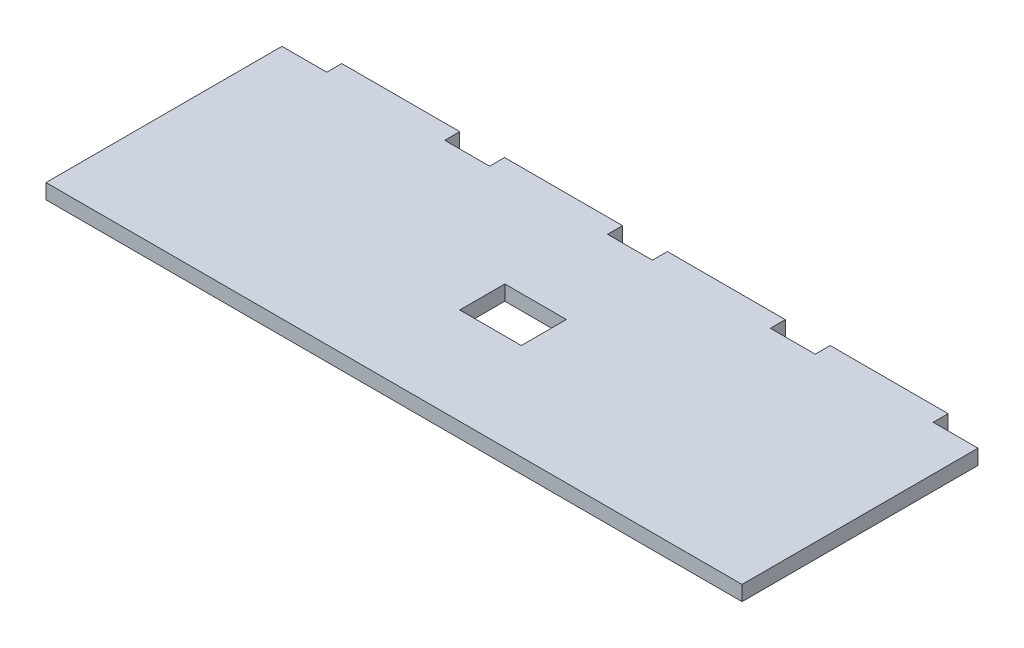
ISO-10303-21;
HEADER;
FILE_DESCRIPTION(('STEP AP214'),'2;1');
FILE_NAME('part.step','',(''),(''),'','','');
FILE_SCHEMA(('AUTOMOTIVE_DESIGN { 1 0 10303 214 1 1 1 1 }'));
ENDSEC;
DATA;
#1=APPLICATION_CONTEXT('core data for automotive mechanical design processes');
#2=APPLICATION_PROTOCOL_DEFINITION('international standard','automotive_design',2000,#1);
#3=PRODUCT_CONTEXT('',#1,'mechanical');
#4=PRODUCT('Part','Part','',(#3));
#5=PRODUCT_RELATED_PRODUCT_CATEGORY('part','',(#4));
#6=PRODUCT_DEFINITION_FORMATION('','',#4);
#7=PRODUCT_DEFINITION_CONTEXT('part definition',#1,'design');
#8=PRODUCT_DEFINITION('design','',#6,#7);
#9=PRODUCT_DEFINITION_SHAPE('','',#8);
#10=(LENGTH_UNIT() NAMED_UNIT(*) SI_UNIT(.MILLI.,.METRE.));
#11=(NAMED_UNIT(*) PLANE_ANGLE_UNIT() SI_UNIT($,.RADIAN.));
#12=(NAMED_UNIT(*) SI_UNIT($,.STERADIAN.) SOLID_ANGLE_UNIT());
#13=UNCERTAINTY_MEASURE_WITH_UNIT(LENGTH_MEASURE(1.E-05),#10,'distance_accuracy_value','');
#14=(GEOMETRIC_REPRESENTATION_CONTEXT(3) GLOBAL_UNCERTAINTY_ASSIGNED_CONTEXT((#13)) GLOBAL_UNIT_ASSIGNED_CONTEXT((#10,
#11,#12)) REPRESENTATION_CONTEXT('',''));
#15=CARTESIAN_POINT('',(0.,0.,0.));
#16=DIRECTION('',(0.,0.,1.));
#17=DIRECTION('',(1.,0.,0.));
#18=AXIS2_PLACEMENT_3D('',#15,#16,#17);
#19=CARTESIAN_POINT('',(0.,6.35,0.));
#20=DIRECTION('',(0.,1.,0.));
#21=DIRECTION('',(0.,0.,1.));
#22=AXIS2_PLACEMENT_3D('',#19,#20,#21);
#23=PLANE('',#22);
#24=DIRECTION('',(-1.,0.,0.));
#25=VECTOR('',#24,1.);
#26=CARTESIAN_POINT('',(0.,6.35,0.));
#27=LINE('',#26,#25);
#28=CARTESIAN_POINT('',(19.,6.35,0.));
#29=VERTEX_POINT('',#28);
#30=CARTESIAN_POINT('',(0.,6.35,0.));
#31=VERTEX_POINT('',#30);
#32=EDGE_CURVE('E230',#29,#31,#27,.T.);
#33=ORIENTED_EDGE('',*,*,#32,.T.);
#34=DIRECTION('',(0.,0.,1.));
#35=VECTOR('',#34,1.);
#36=CARTESIAN_POINT('',(0.,6.35,0.));
#37=LINE('',#36,#35);
#38=CARTESIAN_POINT('',(0.,6.35,100.));
#39=VERTEX_POINT('',#38);
#40=EDGE_CURVE('E233',#31,#39,#37,.T.);
#41=ORIENTED_EDGE('',*,*,#40,.T.);
#42=DIRECTION('',(1.,0.,0.));
#43=VECTOR('',#42,1.);
#44=CARTESIAN_POINT('',(0.,6.35,100.));
#45=LINE('',#44,#43);
#46=CARTESIAN_POINT('',(295.,6.35,100.));
#47=VERTEX_POINT('',#46);
#48=EDGE_CURVE('E236',#39,#47,#45,.T.);
#49=ORIENTED_EDGE('',*,*,#48,.T.);
#50=DIRECTION('',(0.,0.,-1.));
#51=VECTOR('',#50,1.);
#52=CARTESIAN_POINT('',(295.,6.35,0.));
#53=LINE('',#52,#51);
#54=CARTESIAN_POINT('',(295.,6.35,0.));
#55=VERTEX_POINT('',#54);
#56=EDGE_CURVE('E238',#47,#55,#53,.T.);
#57=ORIENTED_EDGE('',*,*,#56,.T.);
#58=DIRECTION('',(-1.,0.,0.));
#59=VECTOR('',#58,1.);
#60=CARTESIAN_POINT('',(276.,6.35,0.));
#61=LINE('',#60,#59);
#62=CARTESIAN_POINT('',(276.,6.35,0.));
#63=VERTEX_POINT('',#62);
#64=EDGE_CURVE('E240',#55,#63,#61,.T.);
#65=ORIENTED_EDGE('',*,*,#64,.T.);
#66=DIRECTION('',(0.,0.,-1.));
#67=VECTOR('',#66,1.);
#68=CARTESIAN_POINT('',(276.,6.35,0.));
#69=LINE('',#68,#67);
#70=CARTESIAN_POINT('',(276.,6.35,-6.35));
#71=VERTEX_POINT('',#70);
#72=EDGE_CURVE('E242',#63,#71,#69,.T.);
#73=ORIENTED_EDGE('',*,*,#72,.T.);
#74=DIRECTION('',(-1.,0.,0.));
#75=VECTOR('',#74,1.);
#76=CARTESIAN_POINT('',(226.,6.35,-6.35));
#77=LINE('',#76,#75);
#78=CARTESIAN_POINT('',(226.,6.35,-6.35));
#79=VERTEX_POINT('',#78);
#80=EDGE_CURVE('E244',#71,#79,#77,.T.);
#81=ORIENTED_EDGE('',*,*,#80,.T.);
#82=DIRECTION('',(0.,0.,1.));
#83=VECTOR('',#82,1.);
#84=CARTESIAN_POINT('',(226.,6.35,0.));
#85=LINE('',#84,#83);
#86=CARTESIAN_POINT('',(226.,6.35,0.));
#87=VERTEX_POINT('',#86);
#88=EDGE_CURVE('E246',#79,#87,#85,.T.);
#89=ORIENTED_EDGE('',*,*,#88,.T.);
#90=DIRECTION('',(-1.,0.,0.));
#91=VECTOR('',#90,1.);
#92=CARTESIAN_POINT('',(207.,6.35,0.));
#93=LINE('',#92,#91);
#94=CARTESIAN_POINT('',(207.,6.35,0.));
#95=VERTEX_POINT('',#94);
#96=EDGE_CURVE('E248',#87,#95,#93,.T.);
#97=ORIENTED_EDGE('',*,*,#96,.T.);
#98=DIRECTION('',(0.,0.,-1.));
#99=VECTOR('',#98,1.);
#100=CARTESIAN_POINT('',(207.,6.35,0.));
#101=LINE('',#100,#99);
#102=CARTESIAN_POINT('',(207.,6.35,-6.35));
#103=VERTEX_POINT('',#102);
#104=EDGE_CURVE('E250',#95,#103,#101,.T.);
#105=ORIENTED_EDGE('',*,*,#104,.T.);
#106=DIRECTION('',(-1.,0.,0.));
#107=VECTOR('',#106,1.);
#108=CARTESIAN_POINT('',(157.,6.35,-6.35));
#109=LINE('',#108,#107);
#110=CARTESIAN_POINT('',(157.,6.35,-6.35));
#111=VERTEX_POINT('',#110);
#112=EDGE_CURVE('E252',#103,#111,#109,.T.);
#113=ORIENTED_EDGE('',*,*,#112,.T.);
#114=DIRECTION('',(0.,0.,1.));
#115=VECTOR('',#114,1.);
#116=CARTESIAN_POINT('',(157.,6.35,0.));
#117=LINE('',#116,#115);
#118=CARTESIAN_POINT('',(157.,6.35,0.));
#119=VERTEX_POINT('',#118);
#120=EDGE_CURVE('E254',#111,#119,#117,.T.);
#121=ORIENTED_EDGE('',*,*,#120,.T.);
#122=DIRECTION('',(-1.,0.,0.));
#123=VECTOR('',#122,1.);
#124=CARTESIAN_POINT('',(138.,6.35,0.));
#125=LINE('',#124,#123);
#126=CARTESIAN_POINT('',(138.,6.35,0.));
#127=VERTEX_POINT('',#126);
#128=EDGE_CURVE('E256',#119,#127,#125,.T.);
#129=ORIENTED_EDGE('',*,*,#128,.T.);
#130=DIRECTION('',(0.,0.,-1.));
#131=VECTOR('',#130,1.);
#132=CARTESIAN_POINT('',(138.,6.35,0.));
#133=LINE('',#132,#131);
#134=CARTESIAN_POINT('',(138.,6.35,-6.35));
#135=VERTEX_POINT('',#134);
#136=EDGE_CURVE('E258',#127,#135,#133,.T.);
#137=ORIENTED_EDGE('',*,*,#136,.T.);
#138=DIRECTION('',(-1.,0.,0.));
#139=VECTOR('',#138,1.);
#140=CARTESIAN_POINT('',(88.,6.35,-6.35));
#141=LINE('',#140,#139);
#142=CARTESIAN_POINT('',(88.,6.35,-6.35));
#143=VERTEX_POINT('',#142);
#144=EDGE_CURVE('E260',#135,#143,#141,.T.);
#145=ORIENTED_EDGE('',*,*,#144,.T.);
#146=DIRECTION('',(0.,0.,1.));
#147=VECTOR('',#146,1.);
#148=CARTESIAN_POINT('',(88.,6.35,0.));
#149=LINE('',#148,#147);
#150=CARTESIAN_POINT('',(88.,6.35,0.));
#151=VERTEX_POINT('',#150);
#152=EDGE_CURVE('E262',#143,#151,#149,.T.);
#153=ORIENTED_EDGE('',*,*,#152,.T.);
#154=DIRECTION('',(-1.,0.,0.));
#155=VECTOR('',#154,1.);
#156=CARTESIAN_POINT('',(69.,6.35,0.));
#157=LINE('',#156,#155);
#158=CARTESIAN_POINT('',(69.,6.35,0.));
#159=VERTEX_POINT('',#158);
#160=EDGE_CURVE('E264',#151,#159,#157,.T.);
#161=ORIENTED_EDGE('',*,*,#160,.T.);
#162=DIRECTION('',(0.,0.,-1.));
#163=VECTOR('',#162,1.);
#164=CARTESIAN_POINT('',(69.,6.35,0.));
#165=LINE('',#164,#163);
#166=CARTESIAN_POINT('',(69.,6.35,-6.35));
#167=VERTEX_POINT('',#166);
#168=EDGE_CURVE('E266',#159,#167,#165,.T.);
#169=ORIENTED_EDGE('',*,*,#168,.T.);
#170=DIRECTION('',(-1.,0.,0.));
#171=VECTOR('',#170,1.);
#172=CARTESIAN_POINT('',(19.,6.35,-6.35));
#173=LINE('',#172,#171);
#174=CARTESIAN_POINT('',(19.,6.35,-6.35));
#175=VERTEX_POINT('',#174);
#176=EDGE_CURVE('E268',#167,#175,#173,.T.);
#177=ORIENTED_EDGE('',*,*,#176,.T.);
#178=DIRECTION('',(0.,0.,1.));
#179=VECTOR('',#178,1.);
#180=CARTESIAN_POINT('',(19.,6.35,0.));
#181=LINE('',#180,#179);
#182=EDGE_CURVE('E270',#175,#29,#181,.T.);
#183=ORIENTED_EDGE('',*,*,#182,.T.);
#184=EDGE_LOOP('',(#33,#41,#49,#57,#65,#73,#81,#89,#97,#105,#113,#121,#129,#137,#145,#153,#161,
#169,#177,#183));
#185=FACE_BOUND('',#184,.T.);
#186=DIRECTION('',(1.,0.,0.));
#187=VECTOR('',#186,1.);
#188=CARTESIAN_POINT('',(134.45,6.35,59.1));
#189=LINE('',#188,#187);
#190=CARTESIAN_POINT('',(134.45,6.35,59.1));
#191=VERTEX_POINT('',#190);
#192=CARTESIAN_POINT('',(160.55,6.35,59.1));
#193=VERTEX_POINT('',#192);
#194=EDGE_CURVE('E202',#191,#193,#189,.T.);
#195=ORIENTED_EDGE('',*,*,#194,.F.);
#196=DIRECTION('',(0.,0.,1.));
#197=VECTOR('',#196,1.);
#198=CARTESIAN_POINT('',(134.45,6.35,40.));
#199=LINE('',#198,#197);
#200=CARTESIAN_POINT('',(134.45,6.35,40.));
#201=VERTEX_POINT('',#200);
#202=EDGE_CURVE('E194',#201,#191,#199,.T.);
#203=ORIENTED_EDGE('',*,*,#202,.F.);
#204=DIRECTION('',(-1.,0.,0.));
#205=VECTOR('',#204,1.);
#206=CARTESIAN_POINT('',(134.45,6.35,40.));
#207=LINE('',#206,#205);
#208=CARTESIAN_POINT('',(160.55,6.35,40.));
#209=VERTEX_POINT('',#208);
#210=EDGE_CURVE('E216',#209,#201,#207,.T.);
#211=ORIENTED_EDGE('',*,*,#210,.F.);
#212=DIRECTION('',(0.,0.,-1.));
#213=VECTOR('',#212,1.);
#214=CARTESIAN_POINT('',(160.55,6.35,40.));
#215=LINE('',#214,#213);
#216=EDGE_CURVE('E214',#193,#209,#215,.T.);
#217=ORIENTED_EDGE('',*,*,#216,.F.);
#218=EDGE_LOOP('',(#195,#203,#211,#217));
#219=FACE_BOUND('',#218,.T.);
#220=ADVANCED_FACE('F33',(#185,#219),#23,.T.);
#221=CARTESIAN_POINT('',(0.,0.,0.));
#222=DIRECTION('',(0.,1.,0.));
#223=DIRECTION('',(0.,0.,1.));
#224=AXIS2_PLACEMENT_3D('',#221,#222,#223);
#225=PLANE('',#224);
#226=DIRECTION('',(-1.,0.,0.));
#227=VECTOR('',#226,1.);
#228=CARTESIAN_POINT('',(0.,0.,0.));
#229=LINE('',#228,#227);
#230=CARTESIAN_POINT('',(19.,0.,0.));
#231=VERTEX_POINT('',#230);
#232=CARTESIAN_POINT('',(0.,0.,0.));
#233=VERTEX_POINT('',#232);
#234=EDGE_CURVE('E210',#231,#233,#229,.T.);
#235=ORIENTED_EDGE('',*,*,#234,.F.);
#236=DIRECTION('',(0.,0.,1.));
#237=VECTOR('',#236,1.);
#238=CARTESIAN_POINT('',(19.,0.,0.));
#239=LINE('',#238,#237);
#240=CARTESIAN_POINT('',(19.,0.,-6.35));
#241=VERTEX_POINT('',#240);
#242=EDGE_CURVE('E234',#241,#231,#239,.T.);
#243=ORIENTED_EDGE('',*,*,#242,.F.);
#244=DIRECTION('',(-1.,0.,0.));
#245=VECTOR('',#244,1.);
#246=CARTESIAN_POINT('',(19.,0.,-6.35));
#247=LINE('',#246,#245);
#248=CARTESIAN_POINT('',(69.,0.,-6.35));
#249=VERTEX_POINT('',#248);
#250=EDGE_CURVE('E309',#249,#241,#247,.T.);
#251=ORIENTED_EDGE('',*,*,#250,.F.);
#252=DIRECTION('',(0.,0.,-1.));
#253=VECTOR('',#252,1.);
#254=CARTESIAN_POINT('',(69.,0.,0.));
#255=LINE('',#254,#253);
#256=CARTESIAN_POINT('',(69.,0.,0.));
#257=VERTEX_POINT('',#256);
#258=EDGE_CURVE('E307',#257,#249,#255,.T.);
#259=ORIENTED_EDGE('',*,*,#258,.F.);
#260=DIRECTION('',(-1.,0.,0.));
#261=VECTOR('',#260,1.);
#262=CARTESIAN_POINT('',(69.,0.,0.));
#263=LINE('',#262,#261);
#264=CARTESIAN_POINT('',(88.,0.,0.));
#265=VERTEX_POINT('',#264);
#266=EDGE_CURVE('E305',#265,#257,#263,.T.);
#267=ORIENTED_EDGE('',*,*,#266,.F.);
#268=DIRECTION('',(0.,0.,1.));
#269=VECTOR('',#268,1.);
#270=CARTESIAN_POINT('',(88.,0.,0.));
#271=LINE('',#270,#269);
#272=CARTESIAN_POINT('',(88.,0.,-6.35));
#273=VERTEX_POINT('',#272);
#274=EDGE_CURVE('E303',#273,#265,#271,.T.);
#275=ORIENTED_EDGE('',*,*,#274,.F.);
#276=DIRECTION('',(-1.,0.,0.));
#277=VECTOR('',#276,1.);
#278=CARTESIAN_POINT('',(88.,0.,-6.35));
#279=LINE('',#278,#277);
#280=CARTESIAN_POINT('',(138.,0.,-6.35));
#281=VERTEX_POINT('',#280);
#282=EDGE_CURVE('E301',#281,#273,#279,.T.);
#283=ORIENTED_EDGE('',*,*,#282,.F.);
#284=DIRECTION('',(0.,0.,-1.));
#285=VECTOR('',#284,1.);
#286=CARTESIAN_POINT('',(138.,0.,0.));
#287=LINE('',#286,#285);
#288=CARTESIAN_POINT('',(138.,0.,0.));
#289=VERTEX_POINT('',#288);
#290=EDGE_CURVE('E299',#289,#281,#287,.T.);
#291=ORIENTED_EDGE('',*,*,#290,.F.);
#292=DIRECTION('',(-1.,0.,0.));
#293=VECTOR('',#292,1.);
#294=CARTESIAN_POINT('',(138.,0.,0.));
#295=LINE('',#294,#293);
#296=CARTESIAN_POINT('',(157.,0.,0.));
#297=VERTEX_POINT('',#296);
#298=EDGE_CURVE('E297',#297,#289,#295,.T.);
#299=ORIENTED_EDGE('',*,*,#298,.F.);
#300=DIRECTION('',(0.,0.,1.));
#301=VECTOR('',#300,1.);
#302=CARTESIAN_POINT('',(157.,0.,0.));
#303=LINE('',#302,#301);
#304=CARTESIAN_POINT('',(157.,0.,-6.35));
#305=VERTEX_POINT('',#304);
#306=EDGE_CURVE('E295',#305,#297,#303,.T.);
#307=ORIENTED_EDGE('',*,*,#306,.F.);
#308=DIRECTION('',(-1.,0.,0.));
#309=VECTOR('',#308,1.);
#310=CARTESIAN_POINT('',(157.,0.,-6.35));
#311=LINE('',#310,#309);
#312=CARTESIAN_POINT('',(207.,0.,-6.35));
#313=VERTEX_POINT('',#312);
#314=EDGE_CURVE('E293',#313,#305,#311,.T.);
#315=ORIENTED_EDGE('',*,*,#314,.F.);
#316=DIRECTION('',(0.,0.,-1.));
#317=VECTOR('',#316,1.);
#318=CARTESIAN_POINT('',(207.,0.,0.));
#319=LINE('',#318,#317);
#320=CARTESIAN_POINT('',(207.,0.,0.));
#321=VERTEX_POINT('',#320);
#322=EDGE_CURVE('E291',#321,#313,#319,.T.);
#323=ORIENTED_EDGE('',*,*,#322,.F.);
#324=DIRECTION('',(-1.,0.,0.));
#325=VECTOR('',#324,1.);
#326=CARTESIAN_POINT('',(207.,0.,0.));
#327=LINE('',#326,#325);
#328=CARTESIAN_POINT('',(226.,0.,0.));
#329=VERTEX_POINT('',#328);
#330=EDGE_CURVE('E289',#329,#321,#327,.T.);
#331=ORIENTED_EDGE('',*,*,#330,.F.);
#332=DIRECTION('',(0.,0.,1.));
#333=VECTOR('',#332,1.);
#334=CARTESIAN_POINT('',(226.,0.,0.));
#335=LINE('',#334,#333);
#336=CARTESIAN_POINT('',(226.,0.,-6.35));
#337=VERTEX_POINT('',#336);
#338=EDGE_CURVE('E287',#337,#329,#335,.T.);
#339=ORIENTED_EDGE('',*,*,#338,.F.);
#340=DIRECTION('',(-1.,0.,0.));
#341=VECTOR('',#340,1.);
#342=CARTESIAN_POINT('',(226.,0.,-6.35));
#343=LINE('',#342,#341);
#344=CARTESIAN_POINT('',(276.,0.,-6.35));
#345=VERTEX_POINT('',#344);
#346=EDGE_CURVE('E285',#345,#337,#343,.T.);
#347=ORIENTED_EDGE('',*,*,#346,.F.);
#348=DIRECTION('',(0.,0.,-1.));
#349=VECTOR('',#348,1.);
#350=CARTESIAN_POINT('',(276.,0.,0.));
#351=LINE('',#350,#349);
#352=CARTESIAN_POINT('',(276.,0.,0.));
#353=VERTEX_POINT('',#352);
#354=EDGE_CURVE('E283',#353,#345,#351,.T.);
#355=ORIENTED_EDGE('',*,*,#354,.F.);
#356=DIRECTION('',(-1.,0.,0.));
#357=VECTOR('',#356,1.);
#358=CARTESIAN_POINT('',(276.,0.,0.));
#359=LINE('',#358,#357);
#360=CARTESIAN_POINT('',(295.,0.,0.));
#361=VERTEX_POINT('',#360);
#362=EDGE_CURVE('E281',#361,#353,#359,.T.);
#363=ORIENTED_EDGE('',*,*,#362,.F.);
#364=DIRECTION('',(0.,0.,-1.));
#365=VECTOR('',#364,1.);
#366=CARTESIAN_POINT('',(295.,0.,0.));
#367=LINE('',#366,#365);
#368=CARTESIAN_POINT('',(295.,0.,100.));
#369=VERTEX_POINT('',#368);
#370=EDGE_CURVE('E279',#369,#361,#367,.T.);
#371=ORIENTED_EDGE('',*,*,#370,.F.);
#372=DIRECTION('',(1.,0.,0.));
#373=VECTOR('',#372,1.);
#374=CARTESIAN_POINT('',(0.,0.,100.));
#375=LINE('',#374,#373);
#376=CARTESIAN_POINT('',(0.,0.,100.));
#377=VERTEX_POINT('',#376);
#378=EDGE_CURVE('E277',#377,#369,#375,.T.);
#379=ORIENTED_EDGE('',*,*,#378,.F.);
#380=DIRECTION('',(0.,0.,1.));
#381=VECTOR('',#380,1.);
#382=CARTESIAN_POINT('',(0.,0.,0.));
#383=LINE('',#382,#381);
#384=EDGE_CURVE('E275',#233,#377,#383,.T.);
#385=ORIENTED_EDGE('',*,*,#384,.F.);
#386=EDGE_LOOP('',(#235,#243,#251,#259,#267,#275,#283,#291,#299,#307,#315,#323,#331,#339,#347,
#355,#363,#371,#379,#385));
#387=FACE_BOUND('',#386,.T.);
#388=DIRECTION('',(0.,0.,1.));
#389=VECTOR('',#388,1.);
#390=CARTESIAN_POINT('',(134.45,0.,40.));
#391=LINE('',#390,#389);
#392=CARTESIAN_POINT('',(134.45,0.,40.));
#393=VERTEX_POINT('',#392);
#394=CARTESIAN_POINT('',(134.45,0.,59.1));
#395=VERTEX_POINT('',#394);
#396=EDGE_CURVE('E56',#393,#395,#391,.T.);
#397=ORIENTED_EDGE('',*,*,#396,.T.);
#398=DIRECTION('',(1.,0.,0.));
#399=VECTOR('',#398,1.);
#400=CARTESIAN_POINT('',(134.45,0.,59.1));
#401=LINE('',#400,#399);
#402=CARTESIAN_POINT('',(160.55,0.,59.1));
#403=VERTEX_POINT('',#402);
#404=EDGE_CURVE('E209',#395,#403,#401,.T.);
#405=ORIENTED_EDGE('',*,*,#404,.T.);
#406=DIRECTION('',(0.,0.,-1.));
#407=VECTOR('',#406,1.);
#408=CARTESIAN_POINT('',(160.55,0.,40.));
#409=LINE('',#408,#407);
#410=CARTESIAN_POINT('',(160.55,0.,40.));
#411=VERTEX_POINT('',#410);
#412=EDGE_CURVE('E222',#403,#411,#409,.T.);
#413=ORIENTED_EDGE('',*,*,#412,.T.);
#414=DIRECTION('',(-1.,0.,0.));
#415=VECTOR('',#414,1.);
#416=CARTESIAN_POINT('',(134.45,0.,40.));
#417=LINE('',#416,#415);
#418=EDGE_CURVE('E203',#411,#393,#417,.T.);
#419=ORIENTED_EDGE('',*,*,#418,.T.);
#420=EDGE_LOOP('',(#397,#405,#413,#419));
#421=FACE_BOUND('',#420,.T.);
#422=ADVANCED_FACE('F375',(#387,#421),#225,.F.);
#423=CARTESIAN_POINT('',(0.,6.35,0.));
#424=DIRECTION('',(0.,0.,1.));
#425=DIRECTION('',(1.,0.,0.));
#426=AXIS2_PLACEMENT_3D('',#423,#424,#425);
#427=PLANE('',#426);
#428=ORIENTED_EDGE('',*,*,#234,.T.);
#429=DIRECTION('',(0.,-1.,0.));
#430=VECTOR('',#429,1.);
#431=CARTESIAN_POINT('',(0.,6.35,0.));
#432=LINE('',#431,#430);
#433=EDGE_CURVE('E11',#31,#233,#432,.T.);
#434=ORIENTED_EDGE('',*,*,#433,.F.);
#435=ORIENTED_EDGE('',*,*,#32,.F.);
#436=DIRECTION('',(0.,-1.,0.));
#437=VECTOR('',#436,1.);
#438=CARTESIAN_POINT('',(19.,6.35,0.));
#439=LINE('',#438,#437);
#440=EDGE_CURVE('E272',#29,#231,#439,.T.);
#441=ORIENTED_EDGE('',*,*,#440,.T.);
#442=EDGE_LOOP('',(#428,#434,#435,#441));
#443=FACE_BOUND('',#442,.T.);
#444=ADVANCED_FACE('F35',(#443),#427,.F.);
#445=CARTESIAN_POINT('',(0.,6.35,0.));
#446=DIRECTION('',(1.,0.,0.));
#447=DIRECTION('',(0.,0.,-1.));
#448=AXIS2_PLACEMENT_3D('',#445,#446,#447);
#449=PLANE('',#448);
#450=ORIENTED_EDGE('',*,*,#384,.T.);
#451=DIRECTION('',(0.,-1.,0.));
#452=VECTOR('',#451,1.);
#453=CARTESIAN_POINT('',(0.,6.35,100.));
#454=LINE('',#453,#452);
#455=EDGE_CURVE('E41',#39,#377,#454,.T.);
#456=ORIENTED_EDGE('',*,*,#455,.F.);
#457=ORIENTED_EDGE('',*,*,#40,.F.);
#458=ORIENTED_EDGE('',*,*,#433,.T.);
#459=EDGE_LOOP('',(#450,#456,#457,#458));
#460=FACE_BOUND('',#459,.T.);
#461=ADVANCED_FACE('F392',(#460),#449,.F.);
#462=CARTESIAN_POINT('',(0.,6.35,100.));
#463=DIRECTION('',(0.,0.,-1.));
#464=DIRECTION('',(-1.,0.,0.));
#465=AXIS2_PLACEMENT_3D('',#462,#463,#464);
#466=PLANE('',#465);
#467=ORIENTED_EDGE('',*,*,#378,.T.);
#468=DIRECTION('',(0.,-1.,0.));
#469=VECTOR('',#468,1.);
#470=CARTESIAN_POINT('',(295.,6.35,100.));
#471=LINE('',#470,#469);
#472=EDGE_CURVE('E362',#47,#369,#471,.T.);
#473=ORIENTED_EDGE('',*,*,#472,.F.);
#474=ORIENTED_EDGE('',*,*,#48,.F.);
#475=ORIENTED_EDGE('',*,*,#455,.T.);
#476=EDGE_LOOP('',(#467,#473,#474,#475));
#477=FACE_BOUND('',#476,.T.);
#478=ADVANCED_FACE('F369',(#477),#466,.F.);
#479=CARTESIAN_POINT('',(295.,6.35,0.));
#480=DIRECTION('',(-1.,0.,0.));
#481=DIRECTION('',(0.,0.,1.));
#482=AXIS2_PLACEMENT_3D('',#479,#480,#481);
#483=PLANE('',#482);
#484=ORIENTED_EDGE('',*,*,#370,.T.);
#485=DIRECTION('',(0.,-1.,0.));
#486=VECTOR('',#485,1.);
#487=CARTESIAN_POINT('',(295.,6.35,0.));
#488=LINE('',#487,#486);
#489=EDGE_CURVE('E359',#55,#361,#488,.T.);
#490=ORIENTED_EDGE('',*,*,#489,.F.);
#491=ORIENTED_EDGE('',*,*,#56,.F.);
#492=ORIENTED_EDGE('',*,*,#472,.T.);
#493=EDGE_LOOP('',(#484,#490,#491,#492));
#494=FACE_BOUND('',#493,.T.);
#495=ADVANCED_FACE('F381',(#494),#483,.F.);
#496=CARTESIAN_POINT('',(276.,6.35,0.));
#497=DIRECTION('',(0.,0.,1.));
#498=DIRECTION('',(1.,0.,0.));
#499=AXIS2_PLACEMENT_3D('',#496,#497,#498);
#500=PLANE('',#499);
#501=ORIENTED_EDGE('',*,*,#362,.T.);
#502=DIRECTION('',(0.,-1.,0.));
#503=VECTOR('',#502,1.);
#504=CARTESIAN_POINT('',(276.,6.35,0.));
#505=LINE('',#504,#503);
#506=EDGE_CURVE('E356',#63,#353,#505,.T.);
#507=ORIENTED_EDGE('',*,*,#506,.F.);
#508=ORIENTED_EDGE('',*,*,#64,.F.);
#509=ORIENTED_EDGE('',*,*,#489,.T.);
#510=EDGE_LOOP('',(#501,#507,#508,#509));
#511=FACE_BOUND('',#510,.T.);
#512=ADVANCED_FACE('F385',(#511),#500,.F.);
#513=CARTESIAN_POINT('',(276.,6.35,0.));
#514=DIRECTION('',(-1.,0.,0.));
#515=DIRECTION('',(0.,0.,1.));
#516=AXIS2_PLACEMENT_3D('',#513,#514,#515);
#517=PLANE('',#516);
#518=ORIENTED_EDGE('',*,*,#354,.T.);
#519=DIRECTION('',(0.,-1.,0.));
#520=VECTOR('',#519,1.);
#521=CARTESIAN_POINT('',(276.,6.35,-6.35));
#522=LINE('',#521,#520);
#523=EDGE_CURVE('E353',#71,#345,#522,.T.);
#524=ORIENTED_EDGE('',*,*,#523,.F.);
#525=ORIENTED_EDGE('',*,*,#72,.F.);
#526=ORIENTED_EDGE('',*,*,#506,.T.);
#527=EDGE_LOOP('',(#518,#524,#525,#526));
#528=FACE_BOUND('',#527,.T.);
#529=ADVANCED_FACE('F465',(#528),#517,.F.);
#530=CARTESIAN_POINT('',(226.,6.35,-6.35));
#531=DIRECTION('',(0.,0.,1.));
#532=DIRECTION('',(1.,0.,0.));
#533=AXIS2_PLACEMENT_3D('',#530,#531,#532);
#534=PLANE('',#533);
#535=ORIENTED_EDGE('',*,*,#346,.T.);
#536=DIRECTION('',(0.,-1.,0.));
#537=VECTOR('',#536,1.);
#538=CARTESIAN_POINT('',(226.,6.35,-6.35));
#539=LINE('',#538,#537);
#540=EDGE_CURVE('E350',#79,#337,#539,.T.);
#541=ORIENTED_EDGE('',*,*,#540,.F.);
#542=ORIENTED_EDGE('',*,*,#80,.F.);
#543=ORIENTED_EDGE('',*,*,#523,.T.);
#544=EDGE_LOOP('',(#535,#541,#542,#543));
#545=FACE_BOUND('',#544,.T.);
#546=ADVANCED_FACE('F463',(#545),#534,.F.);
#547=CARTESIAN_POINT('',(226.,6.35,0.));
#548=DIRECTION('',(1.,0.,0.));
#549=DIRECTION('',(0.,0.,-1.));
#550=AXIS2_PLACEMENT_3D('',#547,#548,#549);
#551=PLANE('',#550);
#552=ORIENTED_EDGE('',*,*,#338,.T.);
#553=DIRECTION('',(0.,-1.,0.));
#554=VECTOR('',#553,1.);
#555=CARTESIAN_POINT('',(226.,6.35,0.));
#556=LINE('',#555,#554);
#557=EDGE_CURVE('E347',#87,#329,#556,.T.);
#558=ORIENTED_EDGE('',*,*,#557,.F.);
#559=ORIENTED_EDGE('',*,*,#88,.F.);
#560=ORIENTED_EDGE('',*,*,#540,.T.);
#561=EDGE_LOOP('',(#552,#558,#559,#560));
#562=FACE_BOUND('',#561,.T.);
#563=ADVANCED_FACE('F458',(#562),#551,.F.);
#564=CARTESIAN_POINT('',(207.,6.35,0.));
#565=DIRECTION('',(0.,0.,1.));
#566=DIRECTION('',(1.,0.,0.));
#567=AXIS2_PLACEMENT_3D('',#564,#565,#566);
#568=PLANE('',#567);
#569=ORIENTED_EDGE('',*,*,#330,.T.);
#570=DIRECTION('',(0.,-1.,0.));
#571=VECTOR('',#570,1.);
#572=CARTESIAN_POINT('',(207.,6.35,0.));
#573=LINE('',#572,#571);
#574=EDGE_CURVE('E344',#95,#321,#573,.T.);
#575=ORIENTED_EDGE('',*,*,#574,.F.);
#576=ORIENTED_EDGE('',*,*,#96,.F.);
#577=ORIENTED_EDGE('',*,*,#557,.T.);
#578=EDGE_LOOP('',(#569,#575,#576,#577));
#579=FACE_BOUND('',#578,.T.);
#580=ADVANCED_FACE('F453',(#579),#568,.F.);
#581=CARTESIAN_POINT('',(207.,6.35,0.));
#582=DIRECTION('',(-1.,0.,0.));
#583=DIRECTION('',(0.,0.,1.));
#584=AXIS2_PLACEMENT_3D('',#581,#582,#583);
#585=PLANE('',#584);
#586=ORIENTED_EDGE('',*,*,#322,.T.);
#587=DIRECTION('',(0.,-1.,0.));
#588=VECTOR('',#587,1.);
#589=CARTESIAN_POINT('',(207.,6.35,-6.35));
#590=LINE('',#589,#588);
#591=EDGE_CURVE('E341',#103,#313,#590,.T.);
#592=ORIENTED_EDGE('',*,*,#591,.F.);
#593=ORIENTED_EDGE('',*,*,#104,.F.);
#594=ORIENTED_EDGE('',*,*,#574,.T.);
#595=EDGE_LOOP('',(#586,#592,#593,#594));
#596=FACE_BOUND('',#595,.T.);
#597=ADVANCED_FACE('F449',(#596),#585,.F.);
#598=CARTESIAN_POINT('',(157.,6.35,-6.35));
#599=DIRECTION('',(0.,0.,1.));
#600=DIRECTION('',(1.,0.,0.));
#601=AXIS2_PLACEMENT_3D('',#598,#599,#600);
#602=PLANE('',#601);
#603=ORIENTED_EDGE('',*,*,#314,.T.);
#604=DIRECTION('',(0.,-1.,0.));
#605=VECTOR('',#604,1.);
#606=CARTESIAN_POINT('',(157.,6.35,-6.35));
#607=LINE('',#606,#605);
#608=EDGE_CURVE('E338',#111,#305,#607,.T.);
#609=ORIENTED_EDGE('',*,*,#608,.F.);
#610=ORIENTED_EDGE('',*,*,#112,.F.);
#611=ORIENTED_EDGE('',*,*,#591,.T.);
#612=EDGE_LOOP('',(#603,#609,#610,#611));
#613=FACE_BOUND('',#612,.T.);
#614=ADVANCED_FACE('F444',(#613),#602,.F.);
#615=CARTESIAN_POINT('',(157.,6.35,0.));
#616=DIRECTION('',(1.,0.,0.));
#617=DIRECTION('',(0.,0.,-1.));
#618=AXIS2_PLACEMENT_3D('',#615,#616,#617);
#619=PLANE('',#618);
#620=ORIENTED_EDGE('',*,*,#306,.T.);
#621=DIRECTION('',(0.,-1.,0.));
#622=VECTOR('',#621,1.);
#623=CARTESIAN_POINT('',(157.,6.35,0.));
#624=LINE('',#623,#622);
#625=EDGE_CURVE('E335',#119,#297,#624,.T.);
#626=ORIENTED_EDGE('',*,*,#625,.F.);
#627=ORIENTED_EDGE('',*,*,#120,.F.);
#628=ORIENTED_EDGE('',*,*,#608,.T.);
#629=EDGE_LOOP('',(#620,#626,#627,#628));
#630=FACE_BOUND('',#629,.T.);
#631=ADVANCED_FACE('F438',(#630),#619,.F.);
#632=CARTESIAN_POINT('',(138.,6.35,0.));
#633=DIRECTION('',(0.,0.,1.));
#634=DIRECTION('',(1.,0.,0.));
#635=AXIS2_PLACEMENT_3D('',#632,#633,#634);
#636=PLANE('',#635);
#637=ORIENTED_EDGE('',*,*,#298,.T.);
#638=DIRECTION('',(0.,-1.,0.));
#639=VECTOR('',#638,1.);
#640=CARTESIAN_POINT('',(138.,6.35,0.));
#641=LINE('',#640,#639);
#642=EDGE_CURVE('E332',#127,#289,#641,.T.);
#643=ORIENTED_EDGE('',*,*,#642,.F.);
#644=ORIENTED_EDGE('',*,*,#128,.F.);
#645=ORIENTED_EDGE('',*,*,#625,.T.);
#646=EDGE_LOOP('',(#637,#643,#644,#645));
#647=FACE_BOUND('',#646,.T.);
#648=ADVANCED_FACE('F434',(#647),#636,.F.);
#649=CARTESIAN_POINT('',(138.,6.35,0.));
#650=DIRECTION('',(-1.,0.,0.));
#651=DIRECTION('',(0.,0.,1.));
#652=AXIS2_PLACEMENT_3D('',#649,#650,#651);
#653=PLANE('',#652);
#654=ORIENTED_EDGE('',*,*,#290,.T.);
#655=DIRECTION('',(0.,-1.,0.));
#656=VECTOR('',#655,1.);
#657=CARTESIAN_POINT('',(138.,6.35,-6.35));
#658=LINE('',#657,#656);
#659=EDGE_CURVE('E329',#135,#281,#658,.T.);
#660=ORIENTED_EDGE('',*,*,#659,.F.);
#661=ORIENTED_EDGE('',*,*,#136,.F.);
#662=ORIENTED_EDGE('',*,*,#642,.T.);
#663=EDGE_LOOP('',(#654,#660,#661,#662));
#664=FACE_BOUND('',#663,.T.);
#665=ADVANCED_FACE('F429',(#664),#653,.F.);
#666=CARTESIAN_POINT('',(88.,6.35,-6.35));
#667=DIRECTION('',(0.,0.,1.));
#668=DIRECTION('',(1.,0.,0.));
#669=AXIS2_PLACEMENT_3D('',#666,#667,#668);
#670=PLANE('',#669);
#671=ORIENTED_EDGE('',*,*,#282,.T.);
#672=DIRECTION('',(0.,-1.,0.));
#673=VECTOR('',#672,1.);
#674=CARTESIAN_POINT('',(88.,6.35,-6.35));
#675=LINE('',#674,#673);
#676=EDGE_CURVE('E326',#143,#273,#675,.T.);
#677=ORIENTED_EDGE('',*,*,#676,.F.);
#678=ORIENTED_EDGE('',*,*,#144,.F.);
#679=ORIENTED_EDGE('',*,*,#659,.T.);
#680=EDGE_LOOP('',(#671,#677,#678,#679));
#681=FACE_BOUND('',#680,.T.);
#682=ADVANCED_FACE('F423',(#681),#670,.F.);
#683=CARTESIAN_POINT('',(88.,6.35,0.));
#684=DIRECTION('',(1.,0.,0.));
#685=DIRECTION('',(0.,0.,-1.));
#686=AXIS2_PLACEMENT_3D('',#683,#684,#685);
#687=PLANE('',#686);
#688=ORIENTED_EDGE('',*,*,#274,.T.);
#689=DIRECTION('',(0.,-1.,0.));
#690=VECTOR('',#689,1.);
#691=CARTESIAN_POINT('',(88.,6.35,0.));
#692=LINE('',#691,#690);
#693=EDGE_CURVE('E323',#151,#265,#692,.T.);
#694=ORIENTED_EDGE('',*,*,#693,.F.);
#695=ORIENTED_EDGE('',*,*,#152,.F.);
#696=ORIENTED_EDGE('',*,*,#676,.T.);
#697=EDGE_LOOP('',(#688,#694,#695,#696));
#698=FACE_BOUND('',#697,.T.);
#699=ADVANCED_FACE('F419',(#698),#687,.F.);
#700=CARTESIAN_POINT('',(69.,6.35,0.));
#701=DIRECTION('',(0.,0.,1.));
#702=DIRECTION('',(1.,0.,0.));
#703=AXIS2_PLACEMENT_3D('',#700,#701,#702);
#704=PLANE('',#703);
#705=ORIENTED_EDGE('',*,*,#266,.T.);
#706=DIRECTION('',(0.,-1.,0.));
#707=VECTOR('',#706,1.);
#708=CARTESIAN_POINT('',(69.,6.35,0.));
#709=LINE('',#708,#707);
#710=EDGE_CURVE('E320',#159,#257,#709,.T.);
#711=ORIENTED_EDGE('',*,*,#710,.F.);
#712=ORIENTED_EDGE('',*,*,#160,.F.);
#713=ORIENTED_EDGE('',*,*,#693,.T.);
#714=EDGE_LOOP('',(#705,#711,#712,#713));
#715=FACE_BOUND('',#714,.T.);
#716=ADVANCED_FACE('F414',(#715),#704,.F.);
#717=CARTESIAN_POINT('',(69.,6.35,0.));
#718=DIRECTION('',(-1.,0.,0.));
#719=DIRECTION('',(0.,0.,1.));
#720=AXIS2_PLACEMENT_3D('',#717,#718,#719);
#721=PLANE('',#720);
#722=ORIENTED_EDGE('',*,*,#258,.T.);
#723=DIRECTION('',(0.,-1.,0.));
#724=VECTOR('',#723,1.);
#725=CARTESIAN_POINT('',(69.,6.35,-6.35));
#726=LINE('',#725,#724);
#727=EDGE_CURVE('E317',#167,#249,#726,.T.);
#728=ORIENTED_EDGE('',*,*,#727,.F.);
#729=ORIENTED_EDGE('',*,*,#168,.F.);
#730=ORIENTED_EDGE('',*,*,#710,.T.);
#731=EDGE_LOOP('',(#722,#728,#729,#730));
#732=FACE_BOUND('',#731,.T.);
#733=ADVANCED_FACE('F408',(#732),#721,.F.);
#734=CARTESIAN_POINT('',(19.,6.35,-6.35));
#735=DIRECTION('',(0.,0.,1.));
#736=DIRECTION('',(1.,0.,0.));
#737=AXIS2_PLACEMENT_3D('',#734,#735,#736);
#738=PLANE('',#737);
#739=ORIENTED_EDGE('',*,*,#250,.T.);
#740=DIRECTION('',(0.,-1.,0.));
#741=VECTOR('',#740,1.);
#742=CARTESIAN_POINT('',(19.,6.35,-6.35));
#743=LINE('',#742,#741);
#744=EDGE_CURVE('E314',#175,#241,#743,.T.);
#745=ORIENTED_EDGE('',*,*,#744,.F.);
#746=ORIENTED_EDGE('',*,*,#176,.F.);
#747=ORIENTED_EDGE('',*,*,#727,.T.);
#748=EDGE_LOOP('',(#739,#745,#746,#747));
#749=FACE_BOUND('',#748,.T.);
#750=ADVANCED_FACE('F404',(#749),#738,.F.);
#751=CARTESIAN_POINT('',(19.,6.35,0.));
#752=DIRECTION('',(1.,0.,0.));
#753=DIRECTION('',(0.,0.,-1.));
#754=AXIS2_PLACEMENT_3D('',#751,#752,#753);
#755=PLANE('',#754);
#756=ORIENTED_EDGE('',*,*,#242,.T.);
#757=ORIENTED_EDGE('',*,*,#440,.F.);
#758=ORIENTED_EDGE('',*,*,#182,.F.);
#759=ORIENTED_EDGE('',*,*,#744,.T.);
#760=EDGE_LOOP('',(#756,#757,#758,#759));
#761=FACE_BOUND('',#760,.T.);
#762=ADVANCED_FACE('F399',(#761),#755,.F.);
#763=CARTESIAN_POINT('',(134.45,6.35,40.));
#764=DIRECTION('',(1.,0.,0.));
#765=DIRECTION('',(0.,0.,-1.));
#766=AXIS2_PLACEMENT_3D('',#763,#764,#765);
#767=PLANE('',#766);
#768=ORIENTED_EDGE('',*,*,#396,.F.);
#769=DIRECTION('',(0.,-1.,0.));
#770=VECTOR('',#769,1.);
#771=CARTESIAN_POINT('',(134.45,6.35,40.));
#772=LINE('',#771,#770);
#773=EDGE_CURVE('E198',#201,#393,#772,.T.);
#774=ORIENTED_EDGE('',*,*,#773,.F.);
#775=ORIENTED_EDGE('',*,*,#202,.T.);
#776=DIRECTION('',(0.,-1.,0.));
#777=VECTOR('',#776,1.);
#778=CARTESIAN_POINT('',(134.45,6.35,59.1));
#779=LINE('',#778,#777);
#780=EDGE_CURVE('E197',#191,#395,#779,.T.);
#781=ORIENTED_EDGE('',*,*,#780,.T.);
#782=EDGE_LOOP('',(#768,#774,#775,#781));
#783=FACE_BOUND('',#782,.T.);
#784=ADVANCED_FACE('F196',(#783),#767,.T.);
#785=CARTESIAN_POINT('',(134.45,6.35,59.1));
#786=DIRECTION('',(0.,0.,-1.));
#787=DIRECTION('',(-1.,0.,0.));
#788=AXIS2_PLACEMENT_3D('',#785,#786,#787);
#789=PLANE('',#788);
#790=ORIENTED_EDGE('',*,*,#404,.F.);
#791=ORIENTED_EDGE('',*,*,#780,.F.);
#792=ORIENTED_EDGE('',*,*,#194,.T.);
#793=DIRECTION('',(0.,-1.,0.));
#794=VECTOR('',#793,1.);
#795=CARTESIAN_POINT('',(160.55,6.35,59.1));
#796=LINE('',#795,#794);
#797=EDGE_CURVE('E211',#193,#403,#796,.T.);
#798=ORIENTED_EDGE('',*,*,#797,.T.);
#799=EDGE_LOOP('',(#790,#791,#792,#798));
#800=FACE_BOUND('',#799,.T.);
#801=ADVANCED_FACE('F206',(#800),#789,.T.);
#802=CARTESIAN_POINT('',(160.55,6.35,40.));
#803=DIRECTION('',(-1.,0.,0.));
#804=DIRECTION('',(0.,0.,1.));
#805=AXIS2_PLACEMENT_3D('',#802,#803,#804);
#806=PLANE('',#805);
#807=ORIENTED_EDGE('',*,*,#412,.F.);
#808=ORIENTED_EDGE('',*,*,#797,.F.);
#809=ORIENTED_EDGE('',*,*,#216,.T.);
#810=DIRECTION('',(0.,-1.,0.));
#811=VECTOR('',#810,1.);
#812=CARTESIAN_POINT('',(160.55,6.35,40.));
#813=LINE('',#812,#811);
#814=EDGE_CURVE('E48',#209,#411,#813,.T.);
#815=ORIENTED_EDGE('',*,*,#814,.T.);
#816=EDGE_LOOP('',(#807,#808,#809,#815));
#817=FACE_BOUND('',#816,.T.);
#818=ADVANCED_FACE('F571',(#817),#806,.T.);
#819=CARTESIAN_POINT('',(134.45,6.35,40.));
#820=DIRECTION('',(0.,0.,1.));
#821=DIRECTION('',(1.,0.,0.));
#822=AXIS2_PLACEMENT_3D('',#819,#820,#821);
#823=PLANE('',#822);
#824=ORIENTED_EDGE('',*,*,#418,.F.);
#825=ORIENTED_EDGE('',*,*,#814,.F.);
#826=ORIENTED_EDGE('',*,*,#210,.T.);
#827=ORIENTED_EDGE('',*,*,#773,.T.);
#828=EDGE_LOOP('',(#824,#825,#826,#827));
#829=FACE_BOUND('',#828,.T.);
#830=ADVANCED_FACE('F577',(#829),#823,.T.);
#831=CLOSED_SHELL('',(#220,#422,#444,#461,#478,#495,#512,#529,#546,#563,#580,#597,#614,#631,
#648,#665,#682,#699,#716,#733,#750,#762,#784,#801,#818,#830));
#832=MANIFOLD_SOLID_BREP('B2',#831);
#833=ADVANCED_BREP_SHAPE_REPRESENTATION('',(#18,#832),#14);
#834=SHAPE_DEFINITION_REPRESENTATION(#9,#833);
ENDSEC;
END-ISO-10303-21;
